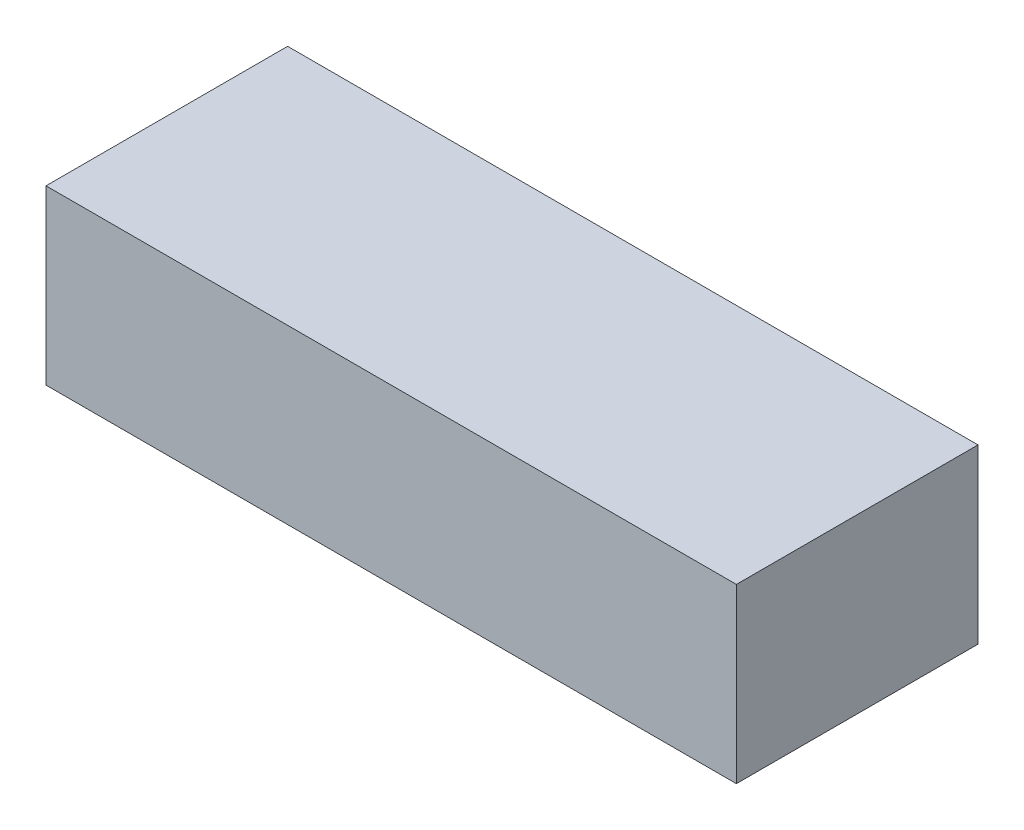
ISO-10303-21;
HEADER;
FILE_DESCRIPTION(('STEP AP214'),'2;1');
FILE_NAME('part.step','',(''),(''),'','','');
FILE_SCHEMA(('AUTOMOTIVE_DESIGN { 1 0 10303 214 1 1 1 1 }'));
ENDSEC;
DATA;
#1=APPLICATION_CONTEXT('core data for automotive mechanical design processes');
#2=APPLICATION_PROTOCOL_DEFINITION('international standard','automotive_design',2000,#1);
#3=PRODUCT_CONTEXT('',#1,'mechanical');
#4=PRODUCT('Part','Part','',(#3));
#5=PRODUCT_RELATED_PRODUCT_CATEGORY('part','',(#4));
#6=PRODUCT_DEFINITION_FORMATION('','',#4);
#7=PRODUCT_DEFINITION_CONTEXT('part definition',#1,'design');
#8=PRODUCT_DEFINITION('design','',#6,#7);
#9=PRODUCT_DEFINITION_SHAPE('','',#8);
#10=(LENGTH_UNIT() NAMED_UNIT(*) SI_UNIT(.MILLI.,.METRE.));
#11=(NAMED_UNIT(*) PLANE_ANGLE_UNIT() SI_UNIT($,.RADIAN.));
#12=(NAMED_UNIT(*) SI_UNIT($,.STERADIAN.) SOLID_ANGLE_UNIT());
#13=UNCERTAINTY_MEASURE_WITH_UNIT(LENGTH_MEASURE(1.E-05),#10,'distance_accuracy_value','');
#14=(GEOMETRIC_REPRESENTATION_CONTEXT(3) GLOBAL_UNCERTAINTY_ASSIGNED_CONTEXT((#13)) GLOBAL_UNIT_ASSIGNED_CONTEXT((#10,
#11,#12)) REPRESENTATION_CONTEXT('',''));
#15=CARTESIAN_POINT('',(0.,0.,0.));
#16=DIRECTION('',(0.,0.,1.));
#17=DIRECTION('',(1.,0.,0.));
#18=AXIS2_PLACEMENT_3D('',#15,#16,#17);
#19=CARTESIAN_POINT('',(100.,50.,-35.));
#20=DIRECTION('',(-1.,0.,0.));
#21=DIRECTION('',(0.,0.,1.));
#22=AXIS2_PLACEMENT_3D('',#19,#20,#21);
#23=PLANE('',#22);
#24=DIRECTION('',(0.,0.,-1.));
#25=VECTOR('',#24,1.);
#26=CARTESIAN_POINT('',(100.,0.,-35.));
#27=LINE('',#26,#25);
#28=CARTESIAN_POINT('',(100.,0.,35.));
#29=VERTEX_POINT('',#28);
#30=CARTESIAN_POINT('',(100.,0.,-35.));
#31=VERTEX_POINT('',#30);
#32=EDGE_CURVE('E96',#29,#31,#27,.T.);
#33=ORIENTED_EDGE('',*,*,#32,.T.);
#34=DIRECTION('',(0.,-1.,0.));
#35=VECTOR('',#34,1.);
#36=CARTESIAN_POINT('',(100.,50.,-35.));
#37=LINE('',#36,#35);
#38=CARTESIAN_POINT('',(100.,50.,-35.));
#39=VERTEX_POINT('',#38);
#40=EDGE_CURVE('E11',#39,#31,#37,.T.);
#41=ORIENTED_EDGE('',*,*,#40,.F.);
#42=DIRECTION('',(0.,0.,-1.));
#43=VECTOR('',#42,1.);
#44=CARTESIAN_POINT('',(100.,50.,-35.));
#45=LINE('',#44,#43);
#46=CARTESIAN_POINT('',(100.,50.,35.));
#47=VERTEX_POINT('',#46);
#48=EDGE_CURVE('E84',#47,#39,#45,.T.);
#49=ORIENTED_EDGE('',*,*,#48,.F.);
#50=DIRECTION('',(0.,-1.,0.));
#51=VECTOR('',#50,1.);
#52=CARTESIAN_POINT('',(100.,50.,35.));
#53=LINE('',#52,#51);
#54=EDGE_CURVE('E92',#47,#29,#53,.T.);
#55=ORIENTED_EDGE('',*,*,#54,.T.);
#56=EDGE_LOOP('',(#33,#41,#49,#55));
#57=FACE_BOUND('',#56,.T.);
#58=ADVANCED_FACE('F33',(#57),#23,.F.);
#59=CARTESIAN_POINT('',(-100.,50.,-35.));
#60=DIRECTION('',(0.,0.,1.));
#61=DIRECTION('',(1.,0.,0.));
#62=AXIS2_PLACEMENT_3D('',#59,#60,#61);
#63=PLANE('',#62);
#64=DIRECTION('',(-1.,0.,0.));
#65=VECTOR('',#64,1.);
#66=CARTESIAN_POINT('',(-100.,0.,-35.));
#67=LINE('',#66,#65);
#68=CARTESIAN_POINT('',(-100.,0.,-35.));
#69=VERTEX_POINT('',#68);
#70=EDGE_CURVE('E88',#31,#69,#67,.T.);
#71=ORIENTED_EDGE('',*,*,#70,.T.);
#72=DIRECTION('',(0.,-1.,0.));
#73=VECTOR('',#72,1.);
#74=CARTESIAN_POINT('',(-100.,50.,-35.));
#75=LINE('',#74,#73);
#76=CARTESIAN_POINT('',(-100.,50.,-35.));
#77=VERTEX_POINT('',#76);
#78=EDGE_CURVE('E41',#77,#69,#75,.T.);
#79=ORIENTED_EDGE('',*,*,#78,.F.);
#80=DIRECTION('',(-1.,0.,0.));
#81=VECTOR('',#80,1.);
#82=CARTESIAN_POINT('',(-100.,50.,-35.));
#83=LINE('',#82,#81);
#84=EDGE_CURVE('E79',#39,#77,#83,.T.);
#85=ORIENTED_EDGE('',*,*,#84,.F.);
#86=ORIENTED_EDGE('',*,*,#40,.T.);
#87=EDGE_LOOP('',(#71,#79,#85,#86));
#88=FACE_BOUND('',#87,.T.);
#89=ADVANCED_FACE('F87',(#88),#63,.F.);
#90=CARTESIAN_POINT('',(-100.,50.,-35.));
#91=DIRECTION('',(1.,0.,0.));
#92=DIRECTION('',(0.,0.,-1.));
#93=AXIS2_PLACEMENT_3D('',#90,#91,#92);
#94=PLANE('',#93);
#95=DIRECTION('',(0.,0.,1.));
#96=VECTOR('',#95,1.);
#97=CARTESIAN_POINT('',(-100.,0.,-35.));
#98=LINE('',#97,#96);
#99=CARTESIAN_POINT('',(-100.,0.,35.));
#100=VERTEX_POINT('',#99);
#101=EDGE_CURVE('E66',#69,#100,#98,.T.);
#102=ORIENTED_EDGE('',*,*,#101,.T.);
#103=DIRECTION('',(0.,-1.,0.));
#104=VECTOR('',#103,1.);
#105=CARTESIAN_POINT('',(-100.,50.,35.));
#106=LINE('',#105,#104);
#107=CARTESIAN_POINT('',(-100.,50.,35.));
#108=VERTEX_POINT('',#107);
#109=EDGE_CURVE('E89',#108,#100,#106,.T.);
#110=ORIENTED_EDGE('',*,*,#109,.F.);
#111=DIRECTION('',(0.,0.,1.));
#112=VECTOR('',#111,1.);
#113=CARTESIAN_POINT('',(-100.,50.,-35.));
#114=LINE('',#113,#112);
#115=EDGE_CURVE('E82',#77,#108,#114,.T.);
#116=ORIENTED_EDGE('',*,*,#115,.F.);
#117=ORIENTED_EDGE('',*,*,#78,.T.);
#118=EDGE_LOOP('',(#102,#110,#116,#117));
#119=FACE_BOUND('',#118,.T.);
#120=ADVANCED_FACE('F90',(#119),#94,.F.);
#121=CARTESIAN_POINT('',(-100.,50.,35.));
#122=DIRECTION('',(0.,0.,-1.));
#123=DIRECTION('',(-1.,0.,0.));
#124=AXIS2_PLACEMENT_3D('',#121,#122,#123);
#125=PLANE('',#124);
#126=DIRECTION('',(1.,0.,0.));
#127=VECTOR('',#126,1.);
#128=CARTESIAN_POINT('',(-100.,0.,35.));
#129=LINE('',#128,#127);
#130=EDGE_CURVE('E72',#100,#29,#129,.T.);
#131=ORIENTED_EDGE('',*,*,#130,.T.);
#132=ORIENTED_EDGE('',*,*,#54,.F.);
#133=DIRECTION('',(1.,0.,0.));
#134=VECTOR('',#133,1.);
#135=CARTESIAN_POINT('',(-100.,50.,35.));
#136=LINE('',#135,#134);
#137=EDGE_CURVE('E49',#108,#47,#136,.T.);
#138=ORIENTED_EDGE('',*,*,#137,.F.);
#139=ORIENTED_EDGE('',*,*,#109,.T.);
#140=EDGE_LOOP('',(#131,#132,#138,#139));
#141=FACE_BOUND('',#140,.T.);
#142=ADVANCED_FACE('F103',(#141),#125,.F.);
#143=CARTESIAN_POINT('',(0.,50.,0.));
#144=DIRECTION('',(0.,1.,0.));
#145=DIRECTION('',(0.,0.,1.));
#146=AXIS2_PLACEMENT_3D('',#143,#144,#145);
#147=PLANE('',#146);
#148=ORIENTED_EDGE('',*,*,#48,.T.);
#149=ORIENTED_EDGE('',*,*,#84,.T.);
#150=ORIENTED_EDGE('',*,*,#115,.T.);
#151=ORIENTED_EDGE('',*,*,#137,.T.);
#152=EDGE_LOOP('',(#148,#149,#150,#151));
#153=FACE_BOUND('',#152,.T.);
#154=ADVANCED_FACE('F80',(#153),#147,.T.);
#155=CARTESIAN_POINT('',(0.,0.,0.));
#156=DIRECTION('',(0.,1.,0.));
#157=DIRECTION('',(0.,0.,1.));
#158=AXIS2_PLACEMENT_3D('',#155,#156,#157);
#159=PLANE('',#158);
#160=ORIENTED_EDGE('',*,*,#32,.F.);
#161=ORIENTED_EDGE('',*,*,#130,.F.);
#162=ORIENTED_EDGE('',*,*,#101,.F.);
#163=ORIENTED_EDGE('',*,*,#70,.F.);
#164=EDGE_LOOP('',(#160,#161,#162,#163));
#165=FACE_BOUND('',#164,.T.);
#166=ADVANCED_FACE('F106',(#165),#159,.F.);
#167=CLOSED_SHELL('',(#58,#89,#120,#142,#154,#166));
#168=MANIFOLD_SOLID_BREP('B2',#167);
#169=ADVANCED_BREP_SHAPE_REPRESENTATION('',(#18,#168),#14);
#170=SHAPE_DEFINITION_REPRESENTATION(#9,#169);
ENDSEC;
END-ISO-10303-21;
